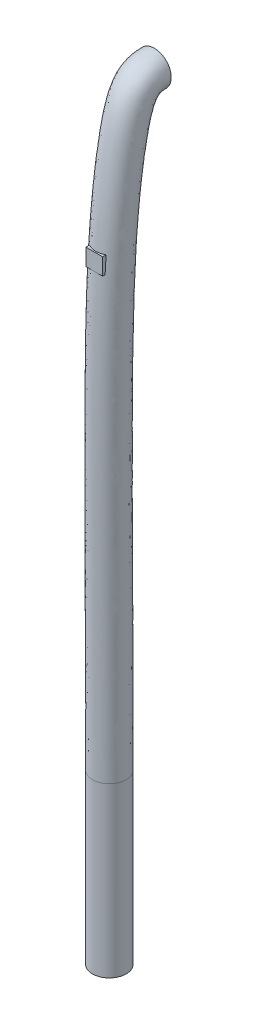
ISO-10303-21;
HEADER;
FILE_DESCRIPTION(('STEP AP214'),'2;1');
FILE_NAME('part.step','',(''),(''),'','','');
FILE_SCHEMA(('AUTOMOTIVE_DESIGN { 1 0 10303 214 1 1 1 1 }'));
ENDSEC;
DATA;
#1=APPLICATION_CONTEXT('core data for automotive mechanical design processes');
#2=APPLICATION_PROTOCOL_DEFINITION('international standard','automotive_design',2000,#1);
#3=PRODUCT_CONTEXT('',#1,'mechanical');
#4=PRODUCT('Part','Part','',(#3));
#5=PRODUCT_RELATED_PRODUCT_CATEGORY('part','',(#4));
#6=PRODUCT_DEFINITION_FORMATION('','',#4);
#7=PRODUCT_DEFINITION_CONTEXT('part definition',#1,'design');
#8=PRODUCT_DEFINITION('design','',#6,#7);
#9=PRODUCT_DEFINITION_SHAPE('','',#8);
#10=(LENGTH_UNIT() NAMED_UNIT(*) SI_UNIT(.MILLI.,.METRE.));
#11=(NAMED_UNIT(*) PLANE_ANGLE_UNIT() SI_UNIT($,.RADIAN.));
#12=(NAMED_UNIT(*) SI_UNIT($,.STERADIAN.) SOLID_ANGLE_UNIT());
#13=UNCERTAINTY_MEASURE_WITH_UNIT(LENGTH_MEASURE(1.E-05),#10,'distance_accuracy_value','');
#14=(GEOMETRIC_REPRESENTATION_CONTEXT(3) GLOBAL_UNCERTAINTY_ASSIGNED_CONTEXT((#13)) GLOBAL_UNIT_ASSIGNED_CONTEXT((#10,
#11,#12)) REPRESENTATION_CONTEXT('',''));
#15=CARTESIAN_POINT('',(0.,0.,0.));
#16=DIRECTION('',(0.,0.,1.));
#17=DIRECTION('',(1.,0.,0.));
#18=AXIS2_PLACEMENT_3D('',#15,#16,#17);
#19=CARTESIAN_POINT('',(-6.5266304410266,344.213384418299,-38.1));
#20=DIRECTION('',(0.,-1.,0.));
#21=DIRECTION('',(0.,0.,-1.));
#22=AXIS2_PLACEMENT_3D('',#19,#20,#21);
#23=PLANE('',#22);
#24=DIRECTION('',(-1.,0.,0.));
#25=VECTOR('',#24,1.);
#26=CARTESIAN_POINT('',(6.1733695589734,344.213384418299,-22.8599999999999));
#27=LINE('',#26,#25);
#28=CARTESIAN_POINT('',(6.1733695589734,344.213384418299,-22.8599999999999));
#29=VERTEX_POINT('',#28);
#30=CARTESIAN_POINT('',(-6.5266304410266,344.213384418299,-22.8599999999999));
#31=VERTEX_POINT('',#30);
#32=EDGE_CURVE('E70',#29,#31,#27,.T.);
#33=ORIENTED_EDGE('',*,*,#32,.F.);
#34=DIRECTION('',(0.,0.,1.));
#35=VECTOR('',#34,1.);
#36=CARTESIAN_POINT('',(6.1733695589734,344.213384418299,-38.1));
#37=LINE('',#36,#35);
#38=CARTESIAN_POINT('',(6.1733695589734,344.213384418299,-25.4717038859224));
#39=VERTEX_POINT('',#38);
#40=EDGE_CURVE('E104',#39,#29,#37,.T.);
#41=ORIENTED_EDGE('',*,*,#40,.F.);
#42=CARTESIAN_POINT('',(-6.5266304410266,344.213384418299,-25.6758827157528));
#43=CARTESIAN_POINT('',(-6.3223854863101,344.213384418299,-25.5534042328857));
#44=CARTESIAN_POINT('',(-6.1146880134214,344.213384418299,-25.4366850930022));
#45=CARTESIAN_POINT('',(-5.69307002536172,344.213384418299,-25.2151121585714));
#46=CARTESIAN_POINT('',(-5.47914980349759,344.213384418299,-25.1102578059174));
#47=CARTESIAN_POINT('',(-5.04575275534056,344.213384418299,-24.9127512424054));
#48=CARTESIAN_POINT('',(-4.82627602637849,344.213384418299,-24.8200988179878));
#49=CARTESIAN_POINT('',(-4.3828601443484,344.213384418299,-24.6474429146679));
#50=CARTESIAN_POINT('',(-4.15892976497471,344.213384418299,-24.5674168970073));
#51=CARTESIAN_POINT('',(-3.70692666551474,344.213384418299,-24.4200672907791));
#52=CARTESIAN_POINT('',(-3.47885398972474,344.213384418299,-24.3527435664652));
#53=CARTESIAN_POINT('',(-3.01930279574901,344.213384418299,-24.2310131918264));
#54=CARTESIAN_POINT('',(-2.78782428969163,344.213384418299,-24.1766064955151));
#55=CARTESIAN_POINT('',(-2.20559702171703,344.213384418299,-24.0569218357249));
#56=CARTESIAN_POINT('',(-1.85313124093958,344.213384418299,-23.999828716781));
#57=CARTESIAN_POINT('',(-1.14446223205283,344.213384418299,-23.915518910946));
#58=CARTESIAN_POINT('',(-0.788256904915703,344.213384418299,-23.8883200210004));
#59=CARTESIAN_POINT('',(-0.0747390800609061,344.213384418299,-23.8640386250858));
#60=CARTESIAN_POINT('',(0.282573648826439,344.213384418299,-23.8669628995182));
#61=CARTESIAN_POINT('',(0.995497831822092,344.213384418299,-23.9029224738871));
#62=CARTESIAN_POINT('',(1.35111014660986,344.213384418299,-23.9359404454096));
#63=CARTESIAN_POINT('',(1.96508363611767,344.213384418299,-24.0191777523242));
#64=CARTESIAN_POINT('',(2.22439160083093,344.213384418299,-24.0625766535412));
#65=CARTESIAN_POINT('',(2.73985384225984,344.213384418299,-24.165397723464));
#66=CARTESIAN_POINT('',(2.99600778200992,344.213384418299,-24.2248215889561));
#67=CARTESIAN_POINT('',(3.50414461686398,344.213384418299,-24.3594638680418));
#68=CARTESIAN_POINT('',(3.75612723406364,344.213384418299,-24.4346833294465));
#69=CARTESIAN_POINT('',(4.25561084879771,344.213384418299,-24.6008460522055));
#70=CARTESIAN_POINT('',(4.50309791315565,344.213384418299,-24.691831208589));
#71=CARTESIAN_POINT('',(4.99192191266633,344.213384418299,-24.8890315674753));
#72=CARTESIAN_POINT('',(5.23325896649831,344.213384418299,-24.9952464758209));
#73=CARTESIAN_POINT('',(5.70885417524314,344.213384418299,-25.2224792957568));
#74=CARTESIAN_POINT('',(5.94311247648754,344.213384418299,-25.3434969010851));
#75=CARTESIAN_POINT('',(6.1733695589734,344.213384418299,-25.4717038859224));
#76=B_SPLINE_CURVE_WITH_KNOTS('',3,(#42,#43,#44,#45,#46,#47,#48,#49,#50,#51,#52,#53,#54,#55,#56,
#57,#58,#59,#60,#61,#62,#63,#64,#65,#66,#67,#68,#69,#70,#71,#72,#73,#74,#75),.UNSPECIFIED.,.F.,
.F.,(4,2,2,2,2,2,2,2,2,2,2,2,2,2,2,2,4),(0.,0.714364192223999,1.42869476755605,2.14301283892543,
2.8560410281273,3.56906159693373,4.28207962724457,5.3519144769764,6.42238588758985,
7.49309825510762,8.56319447920758,9.35146377841871,10.1398165754744,10.9282216849563,
11.7187549281992,12.5092729046318,13.2997745283296),.UNSPECIFIED.);
#77=CARTESIAN_POINT('',(-6.5266304410266,344.213384418299,-25.6758827157528));
#78=VERTEX_POINT('',#77);
#79=EDGE_CURVE('E12',#78,#39,#76,.T.);
#80=ORIENTED_EDGE('',*,*,#79,.F.);
#81=DIRECTION('',(0.,0.,1.));
#82=VECTOR('',#81,1.);
#83=CARTESIAN_POINT('',(-6.5266304410266,344.213384418299,-38.1));
#84=LINE('',#83,#82);
#85=EDGE_CURVE('E106',#78,#31,#84,.T.);
#86=ORIENTED_EDGE('',*,*,#85,.T.);
#87=EDGE_LOOP('',(#33,#41,#80,#86));
#88=FACE_BOUND('',#87,.T.);
#89=ADVANCED_FACE('F51',(#88),#23,.F.);
#90=CARTESIAN_POINT('',(6.1733695589734,344.213384418299,-38.1));
#91=DIRECTION('',(-1.,0.,0.));
#92=DIRECTION('',(0.,-1.,0.));
#93=AXIS2_PLACEMENT_3D('',#90,#91,#92);
#94=PLANE('',#93);
#95=DIRECTION('',(0.,1.,0.));
#96=VECTOR('',#95,1.);
#97=CARTESIAN_POINT('',(6.1733695589734,331.513384418299,-22.8599999999999));
#98=LINE('',#97,#96);
#99=CARTESIAN_POINT('',(6.1733695589734,331.513384418299,-22.8599999999999));
#100=VERTEX_POINT('',#99);
#101=EDGE_CURVE('E92',#100,#29,#98,.T.);
#102=ORIENTED_EDGE('',*,*,#101,.F.);
#103=DIRECTION('',(0.,0.,1.));
#104=VECTOR('',#103,1.);
#105=CARTESIAN_POINT('',(6.1733695589734,331.513384418299,-38.1));
#106=LINE('',#105,#104);
#107=CARTESIAN_POINT('',(6.17336955897341,331.513384418299,-24.6979888195218));
#108=VERTEX_POINT('',#107);
#109=EDGE_CURVE('E111',#108,#100,#106,.T.);
#110=ORIENTED_EDGE('',*,*,#109,.F.);
#111=CARTESIAN_POINT('',(6.1733695589734,344.213384418299,-25.4717038859224));
#112=CARTESIAN_POINT('',(6.1733695589734,343.15704067904,-25.4000205624537));
#113=CARTESIAN_POINT('',(6.1733695589734,342.10056743177,-25.330253551604));
#114=CARTESIAN_POINT('',(6.1733695589734,339.987395542788,-25.1944111689609));
#115=CARTESIAN_POINT('',(6.1733695589734,338.93069690376,-25.128335755419));
#116=CARTESIAN_POINT('',(6.1733695589734,336.814016223512,-24.9995473112987));
#117=CARTESIAN_POINT('',(6.1733695589734,335.754033555326,-24.9368445979307));
#118=CARTESIAN_POINT('',(6.1733695589734,333.63385848236,-24.8148739473477));
#119=CARTESIAN_POINT('',(6.1733695589734,332.573666075336,-24.7556060491059));
#120=CARTESIAN_POINT('',(6.1733695589734,331.513384418299,-24.6979888195218));
#121=B_SPLINE_CURVE_WITH_KNOTS('',3,(#111,#112,#113,#114,#115,#116,#117,#118,#119,#120),
.UNSPECIFIED.,.F.,.F.,(4,2,2,2,4),(0.,3.17631695756363,6.35259798664727,9.53809922389118,
12.7236365985306),.UNSPECIFIED.);
#122=EDGE_CURVE('E63',#39,#108,#121,.T.);
#123=ORIENTED_EDGE('',*,*,#122,.F.);
#124=ORIENTED_EDGE('',*,*,#40,.T.);
#125=EDGE_LOOP('',(#102,#110,#123,#124));
#126=FACE_BOUND('',#125,.T.);
#127=ADVANCED_FACE('F109',(#126),#94,.F.);
#128=CARTESIAN_POINT('',(-6.5266304410266,331.513384418299,-38.1));
#129=DIRECTION('',(0.,-1.,0.));
#130=DIRECTION('',(0.,0.,-1.));
#131=AXIS2_PLACEMENT_3D('',#128,#129,#130);
#132=PLANE('',#131);
#133=ORIENTED_EDGE('',*,*,#109,.T.);
#134=DIRECTION('',(1.,0.,0.));
#135=VECTOR('',#134,1.);
#136=CARTESIAN_POINT('',(-6.5266304410266,331.513384418299,-22.8599999999999));
#137=LINE('',#136,#135);
#138=CARTESIAN_POINT('',(-6.5266304410266,331.513384418299,-22.8599999999999));
#139=VERTEX_POINT('',#138);
#140=EDGE_CURVE('E95',#139,#100,#137,.T.);
#141=ORIENTED_EDGE('',*,*,#140,.F.);
#142=DIRECTION('',(0.,0.,1.));
#143=VECTOR('',#142,1.);
#144=CARTESIAN_POINT('',(-6.5266304410266,331.513384418299,-38.1));
#145=LINE('',#144,#143);
#146=CARTESIAN_POINT('',(-6.5266304410266,331.513384418299,-24.902226215131));
#147=VERTEX_POINT('',#146);
#148=EDGE_CURVE('E116',#147,#139,#145,.T.);
#149=ORIENTED_EDGE('',*,*,#148,.F.);
#150=CARTESIAN_POINT('',(-6.5266304410266,331.513384418299,-24.902226215131));
#151=CARTESIAN_POINT('',(-6.32243107040896,331.513384418299,-24.7797399130251));
#152=CARTESIAN_POINT('',(-6.1147792106793,331.513384418299,-24.6630111907733));
#153=CARTESIAN_POINT('',(-5.69325189354982,331.513384418299,-24.4414159300077));
#154=CARTESIAN_POINT('',(-5.4793767236344,331.513384418299,-24.3365488446387));
#155=CARTESIAN_POINT('',(-5.04606894637347,331.513384418299,-24.1390142248839));
#156=CARTESIAN_POINT('',(-4.82663643501714,331.513384418299,-24.0463464799563));
#157=CARTESIAN_POINT('',(-4.3833081475311,331.513384418299,-23.8736579957013));
#158=CARTESIAN_POINT('',(-4.15942115382069,331.513384418299,-23.7936147039488));
#159=CARTESIAN_POINT('',(-3.70750361740144,331.513384418299,-23.646228896575));
#160=CARTESIAN_POINT('',(-3.47947312003681,331.513384418299,-23.5788862420567));
#161=CARTESIAN_POINT('',(-3.02000491564707,331.513384418299,-23.4571167469439));
#162=CARTESIAN_POINT('',(-2.78856722104739,331.513384418298,-23.4026898592603));
#163=CARTESIAN_POINT('',(-2.20644615490648,331.513384418298,-23.282954804471));
#164=CARTESIAN_POINT('',(-1.85404496511045,331.513384418299,-23.2258304113442));
#165=CARTESIAN_POINT('',(-1.14550203954025,331.513384418299,-23.1414559623627));
#166=CARTESIAN_POINT('',(-0.789358202790038,331.513384418299,-23.1142237029539));
#167=CARTESIAN_POINT('',(-0.0759600736174931,331.513384418299,-23.0898740700172));
#168=CARTESIAN_POINT('',(0.281294451470557,331.513384418299,-23.0927635004537));
#169=CARTESIAN_POINT('',(0.994105054118129,331.513384418299,-23.1286521785193));
#170=CARTESIAN_POINT('',(1.34966199067249,331.513384418299,-23.1616341002415));
#171=CARTESIAN_POINT('',(1.96367456220772,331.513384418299,-23.2448256112122));
#172=CARTESIAN_POINT('',(2.22307520352059,331.513384418299,-23.288223336418));
#173=CARTESIAN_POINT('',(2.73872066141702,331.513384418299,-23.3910573851551));
#174=CARTESIAN_POINT('',(2.99496513853038,331.513384418299,-23.4504954184648));
#175=CARTESIAN_POINT('',(3.50327945071313,331.513384418299,-23.5851807158515));
#176=CARTESIAN_POINT('',(3.75534900499744,331.513384418299,-23.6604290386315));
#177=CARTESIAN_POINT('',(4.25500375867613,331.513384418299,-23.8266640591049));
#178=CARTESIAN_POINT('',(4.50257496753664,331.513384418299,-23.91769282033));
#179=CARTESIAN_POINT('',(4.99156076262391,331.513384418299,-24.1149933920937));
#180=CARTESIAN_POINT('',(5.23297547059981,331.513384418299,-24.2212649009207));
#181=CARTESIAN_POINT('',(5.70871831519847,331.513384418299,-24.4486225521884));
#182=CARTESIAN_POINT('',(5.94304660870776,331.513384418299,-24.5697083663546));
#183=CARTESIAN_POINT('',(6.1733695589734,331.513384418299,-24.6979888195218));
#184=B_SPLINE_CURVE_WITH_KNOTS('',3,(#150,#151,#152,#153,#154,#155,#156,#157,#158,#159,#160,
#161,#162,#163,#164,#165,#166,#167,#168,#169,#170,#171,#172,#173,#174,#175,#176,#177,#178,#179,
#180,#181,#182,#183),.UNSPECIFIED.,.F.,.F.,(4,2,2,2,2,2,2,2,2,2,2,2,2,2,2,2,4),(0.,
0.7142590562994,1.42848516978158,2.14269895519629,2.85562204786328,3.56853734338862,
4.28145003968437,5.35110858033596,6.4214036032489,7.49194039238021,8.56186120312514,
9.35040333258764,10.139029548041,10.9277085890447,11.7185231582784,12.5093220764523,
13.3001034742487),.UNSPECIFIED.);
#185=EDGE_CURVE('E132',#147,#108,#184,.T.);
#186=ORIENTED_EDGE('',*,*,#185,.T.);
#187=EDGE_LOOP('',(#133,#141,#149,#186));
#188=FACE_BOUND('',#187,.T.);
#189=ADVANCED_FACE('F146',(#188),#132,.T.);
#190=CARTESIAN_POINT('',(-6.5266304410266,344.213384418299,-38.1));
#191=DIRECTION('',(-1.,0.,0.));
#192=DIRECTION('',(0.,0.,1.));
#193=AXIS2_PLACEMENT_3D('',#190,#191,#192);
#194=PLANE('',#193);
#195=ORIENTED_EDGE('',*,*,#148,.T.);
#196=DIRECTION('',(0.,-1.,0.));
#197=VECTOR('',#196,1.);
#198=CARTESIAN_POINT('',(-6.5266304410266,344.213384418299,-22.8599999999999));
#199=LINE('',#198,#197);
#200=EDGE_CURVE('E107',#31,#139,#199,.T.);
#201=ORIENTED_EDGE('',*,*,#200,.F.);
#202=ORIENTED_EDGE('',*,*,#85,.F.);
#203=CARTESIAN_POINT('',(-6.5266304410266,344.213384418299,-25.6758827157528));
#204=CARTESIAN_POINT('',(-6.5266304410266,343.157161048179,-25.6042104663231));
#205=CARTESIAN_POINT('',(-6.5266304410266,342.100808147035,-25.5344549808972));
#206=CARTESIAN_POINT('',(-6.5266304410266,339.987876942743,-25.3986359969166));
#207=CARTESIAN_POINT('',(-6.52663044102659,338.931298642281,-25.3325724566001));
#208=CARTESIAN_POINT('',(-6.52663044102659,336.814618013182,-25.2037929231315));
#209=CARTESIAN_POINT('',(-6.52663044102659,335.754515008331,-25.1410880584288));
#210=CARTESIAN_POINT('',(-6.5266304410266,333.634099224984,-25.0191139170957));
#211=CARTESIAN_POINT('',(-6.5266304410266,332.573786444245,-24.9598446794654));
#212=CARTESIAN_POINT('',(-6.5266304410266,331.513384418299,-24.902226215131));
#213=B_SPLINE_CURVE_WITH_KNOTS('',3,(#203,#204,#205,#206,#207,#208,#209,#210,#211,#212),
.UNSPECIFIED.,.F.,.F.,(4,2,2,2,4),(0.,3.17595442500757,6.3518729176656,9.53773491365943,
12.7236330673809),.UNSPECIFIED.);
#214=EDGE_CURVE('E125',#78,#147,#213,.T.);
#215=ORIENTED_EDGE('',*,*,#214,.T.);
#216=EDGE_LOOP('',(#195,#201,#202,#215));
#217=FACE_BOUND('',#216,.T.);
#218=ADVANCED_FACE('F142',(#217),#194,.T.);
#219=CARTESIAN_POINT('',(0.,0.,-21.3818772335764));
#220=CARTESIAN_POINT('',(0.,51.458610160128,-21.3810868579543));
#221=CARTESIAN_POINT('',(0.,142.429630870905,-20.9114867054874));
#222=CARTESIAN_POINT('',(0.,248.887758562846,-20.5579334496353));
#223=CARTESIAN_POINT('',(0.,330.985853185016,-22.2208215617449));
#224=CARTESIAN_POINT('',(0.,380.665207995244,-26.7079206140638));
#225=CARTESIAN_POINT('',(0.,411.197552694387,-31.7616881445268));
#226=CARTESIAN_POINT('',(0.,426.180486995187,-35.1878257889518));
#227=CARTESIAN_POINT('',(0.,434.980023025765,-38.5863292103482));
#228=CARTESIAN_POINT('',(0.,440.538219161758,-41.3501310593408));
#229=CARTESIAN_POINT('',(0.,444.272455319786,-43.6580751227552));
#230=CARTESIAN_POINT('',(0.,448.490830004977,-47.9673863925611));
#231=CARTESIAN_POINT('',(0.,450.892171866904,-51.363232723905));
#232=CARTESIAN_POINT('',(0.,452.767809331428,-55.2141294859461));
#233=CARTESIAN_POINT('',(0.,454.031999763017,-59.3347849307667));
#234=CARTESIAN_POINT('',(0.,454.736631168798,-63.6373449321753));
#235=CARTESIAN_POINT('',(0.,454.86180212385,-66.5599996360718));
#236=CARTESIAN_POINT('',(0.,454.872200750059,-68.0983939840303));
#237=CARTESIAN_POINT('',(25.4,0.,-21.3818772335764));
#238=CARTESIAN_POINT('',(25.4,51.458610160128,-21.3810868579543));
#239=CARTESIAN_POINT('',(25.4,142.429630870905,-20.9114867054874));
#240=CARTESIAN_POINT('',(25.4,248.887758562846,-20.5579334496353));
#241=CARTESIAN_POINT('',(25.4,330.985853185017,-22.2208215617449));
#242=CARTESIAN_POINT('',(25.4,380.665207995244,-26.7079206140638));
#243=CARTESIAN_POINT('',(25.4,411.197552694387,-31.7616881445268));
#244=CARTESIAN_POINT('',(25.4,426.180486995187,-35.1878257889518));
#245=CARTESIAN_POINT('',(25.4,434.980023025765,-38.5863292103482));
#246=CARTESIAN_POINT('',(25.4,440.538219161758,-41.3501310593408));
#247=CARTESIAN_POINT('',(25.4,444.272455319786,-43.6580751227551));
#248=CARTESIAN_POINT('',(25.4,448.490830004977,-47.9673863925611));
#249=CARTESIAN_POINT('',(25.4,450.892171866903,-51.363232723905));
#250=CARTESIAN_POINT('',(25.4,452.767809331428,-55.2141294859461));
#251=CARTESIAN_POINT('',(25.4,454.031999763017,-59.3347849307667));
#252=CARTESIAN_POINT('',(25.4,454.736631168798,-63.6373449321753));
#253=CARTESIAN_POINT('',(25.4,454.86180212385,-66.5599996360718));
#254=CARTESIAN_POINT('',(25.4,454.872200750059,-68.0983939840303));
#255=CARTESIAN_POINT('',(25.4,0.,-46.7818772335764));
#256=CARTESIAN_POINT('',(25.4,51.522081410983,-46.7826676091984));
#257=CARTESIAN_POINT('',(25.4,142.62004462347,-46.3162289592195));
#258=CARTESIAN_POINT('',(25.4,248.796375650522,-45.9374904620759));
#259=CARTESIAN_POINT('',(25.4,330.071903072416,-47.6939599056535));
#260=CARTESIAN_POINT('',(25.4,377.452537891122,-51.7656780830233));
#261=CARTESIAN_POINT('',(25.4,406.674074861576,-56.9362008463299));
#262=CARTESIAN_POINT('',(25.4,419.418181023263,-59.7552699808695));
#263=CARTESIAN_POINT('',(25.4,425.143336652316,-62.0397264776097));
#264=CARTESIAN_POINT('',(25.4,427.666979510293,-63.3488214473732));
#265=CARTESIAN_POINT('',(25.4,428.718355325007,-64.0711632004393));
#266=CARTESIAN_POINT('',(25.4,428.887953950394,-64.2887932389198));
#267=CARTESIAN_POINT('',(25.4,428.925683834491,-64.3373606840663));
#268=CARTESIAN_POINT('',(25.4,429.014483190232,-64.4978637761064));
#269=CARTESIAN_POINT('',(25.4,429.20219283063,-65.0450487315747));
#270=CARTESIAN_POINT('',(25.4,429.39902292605,-66.156224145292));
#271=CARTESIAN_POINT('',(25.4,429.482599376268,-67.3996260404452));
#272=CARTESIAN_POINT('',(25.4,429.472200750059,-68.0983939840303));
#273=CARTESIAN_POINT('',(0.,0.,-46.7818772335764));
#274=CARTESIAN_POINT('',(0.,51.522081410983,-46.7826676091984));
#275=CARTESIAN_POINT('',(0.,142.62004462347,-46.3162289592196));
#276=CARTESIAN_POINT('',(0.,248.796375650522,-45.9374904620759));
#277=CARTESIAN_POINT('',(0.,330.071903072416,-47.6939599056536));
#278=CARTESIAN_POINT('',(0.,377.452537891122,-51.7656780830233));
#279=CARTESIAN_POINT('',(0.,406.674074861576,-56.9362008463299));
#280=CARTESIAN_POINT('',(0.,419.418181023263,-59.7552699808695));
#281=CARTESIAN_POINT('',(0.,425.143336652316,-62.0397264776097));
#282=CARTESIAN_POINT('',(0.,427.666979510293,-63.3488214473732));
#283=CARTESIAN_POINT('',(0.,428.718355325007,-64.0711632004393));
#284=CARTESIAN_POINT('',(0.,428.887953950394,-64.2887932389198));
#285=CARTESIAN_POINT('',(0.,428.925683834491,-64.3373606840663));
#286=CARTESIAN_POINT('',(0.,429.014483190232,-64.4978637761064));
#287=CARTESIAN_POINT('',(0.,429.20219283063,-65.0450487315746));
#288=CARTESIAN_POINT('',(0.,429.39902292605,-66.156224145292));
#289=CARTESIAN_POINT('',(0.,429.482599376268,-67.3996260404452));
#290=CARTESIAN_POINT('',(0.,429.472200750059,-68.0983939840303));
#291=CARTESIAN_POINT('',(-25.4,0.,-46.7818772335764));
#292=CARTESIAN_POINT('',(-25.4,51.522081410983,-46.7826676091984));
#293=CARTESIAN_POINT('',(-25.4,142.62004462347,-46.3162289592195));
#294=CARTESIAN_POINT('',(-25.4,248.796375650522,-45.9374904620759));
#295=CARTESIAN_POINT('',(-25.4,330.071903072416,-47.6939599056535));
#296=CARTESIAN_POINT('',(-25.4,377.452537891122,-51.7656780830233));
#297=CARTESIAN_POINT('',(-25.4,406.674074861576,-56.9362008463299));
#298=CARTESIAN_POINT('',(-25.4,419.418181023263,-59.7552699808695));
#299=CARTESIAN_POINT('',(-25.4,425.143336652316,-62.0397264776097));
#300=CARTESIAN_POINT('',(-25.4,427.666979510293,-63.3488214473732));
#301=CARTESIAN_POINT('',(-25.4,428.718355325007,-64.0711632004393));
#302=CARTESIAN_POINT('',(-25.4,428.887953950394,-64.2887932389198));
#303=CARTESIAN_POINT('',(-25.4,428.925683834491,-64.3373606840663));
#304=CARTESIAN_POINT('',(-25.4,429.014483190232,-64.4978637761064));
#305=CARTESIAN_POINT('',(-25.4,429.20219283063,-65.0450487315747));
#306=CARTESIAN_POINT('',(-25.4,429.39902292605,-66.156224145292));
#307=CARTESIAN_POINT('',(-25.4,429.482599376268,-67.3996260404452));
#308=CARTESIAN_POINT('',(-25.4,429.472200750059,-68.0983939840303));
#309=CARTESIAN_POINT('',(-25.4,0.,-21.3818772335764));
#310=CARTESIAN_POINT('',(-25.4,51.458610160128,-21.3810868579543));
#311=CARTESIAN_POINT('',(-25.4,142.429630870905,-20.9114867054874));
#312=CARTESIAN_POINT('',(-25.4,248.887758562846,-20.5579334496353));
#313=CARTESIAN_POINT('',(-25.4,330.985853185017,-22.2208215617449));
#314=CARTESIAN_POINT('',(-25.4,380.665207995244,-26.7079206140638));
#315=CARTESIAN_POINT('',(-25.4,411.197552694387,-31.7616881445268));
#316=CARTESIAN_POINT('',(-25.4,426.180486995187,-35.1878257889518));
#317=CARTESIAN_POINT('',(-25.4,434.980023025765,-38.5863292103482));
#318=CARTESIAN_POINT('',(-25.4,440.538219161758,-41.3501310593408));
#319=CARTESIAN_POINT('',(-25.4,444.272455319786,-43.6580751227551));
#320=CARTESIAN_POINT('',(-25.4,448.490830004977,-47.9673863925611));
#321=CARTESIAN_POINT('',(-25.4,450.892171866903,-51.363232723905));
#322=CARTESIAN_POINT('',(-25.4,452.767809331428,-55.2141294859461));
#323=CARTESIAN_POINT('',(-25.4,454.031999763017,-59.3347849307667));
#324=CARTESIAN_POINT('',(-25.4,454.736631168798,-63.6373449321753));
#325=CARTESIAN_POINT('',(-25.4,454.86180212385,-66.5599996360718));
#326=CARTESIAN_POINT('',(-25.4,454.872200750059,-68.0983939840303));
#327=CARTESIAN_POINT('',(0.,0.,-21.3818772335764));
#328=CARTESIAN_POINT('',(0.,51.458610160128,-21.3810868579543));
#329=CARTESIAN_POINT('',(0.,142.429630870905,-20.9114867054874));
#330=CARTESIAN_POINT('',(0.,248.887758562846,-20.5579334496353));
#331=CARTESIAN_POINT('',(0.,330.985853185016,-22.2208215617449));
#332=CARTESIAN_POINT('',(0.,380.665207995244,-26.7079206140638));
#333=CARTESIAN_POINT('',(0.,411.197552694387,-31.7616881445268));
#334=CARTESIAN_POINT('',(0.,426.180486995187,-35.1878257889518));
#335=CARTESIAN_POINT('',(0.,434.980023025765,-38.5863292103482));
#336=CARTESIAN_POINT('',(0.,440.538219161758,-41.3501310593408));
#337=CARTESIAN_POINT('',(0.,444.272455319786,-43.6580751227552));
#338=CARTESIAN_POINT('',(0.,448.490830004977,-47.9673863925611));
#339=CARTESIAN_POINT('',(0.,450.892171866904,-51.363232723905));
#340=CARTESIAN_POINT('',(0.,452.767809331428,-55.2141294859461));
#341=CARTESIAN_POINT('',(0.,454.031999763017,-59.3347849307667));
#342=CARTESIAN_POINT('',(0.,454.736631168798,-63.6373449321753));
#343=CARTESIAN_POINT('',(0.,454.86180212385,-66.5599996360718));
#344=CARTESIAN_POINT('',(0.,454.872200750059,-68.0983939840303));
#345=(BOUNDED_SURFACE() B_SPLINE_SURFACE(3,3,((#219,#220,#221,#222,#223,#224,#225,#226,#227,
#228,#229,#230,#231,#232,#233,#234,#235,#236),(#237,#238,#239,#240,#241,#242,#243,#244,#245,
#246,#247,#248,#249,#250,#251,#252,#253,#254),(#255,#256,#257,#258,#259,#260,#261,#262,#263,
#264,#265,#266,#267,#268,#269,#270,#271,#272),(#273,#274,#275,#276,#277,#278,#279,#280,#281,
#282,#283,#284,#285,#286,#287,#288,#289,#290),(#291,#292,#293,#294,#295,#296,#297,#298,#299,
#300,#301,#302,#303,#304,#305,#306,#307,#308),(#309,#310,#311,#312,#313,#314,#315,#316,#317,
#318,#319,#320,#321,#322,#323,#324,#325,#326),(#327,#328,#329,#330,#331,#332,#333,#334,#335,
#336,#337,#338,#339,#340,#341,#342,#343,#344)),.UNSPECIFIED.,.T.,.F.,
.F.) B_SPLINE_SURFACE_WITH_KNOTS((4,3,4),(4,1,1,1,1,1,1,1,1,1,1,1,1,1,1,4),(0.,0.5,1.),(0.,
0.1875,0.375,0.5625,0.75,0.810651319725855,0.875,0.90625,0.910651319725855,0.9375,
0.947916666666667,0.958333333333333,0.96875,0.979166666666707,0.989583333333333,1.),
.UNSPECIFIED.) GEOMETRIC_REPRESENTATION_ITEM() RATIONAL_B_SPLINE_SURFACE(((1.,1.,1.,1.,1.,1.,1.,
1.,1.,1.,1.,1.,1.,1.,1.,1.,1.,1.),(0.333333333333333,0.333333333333333,0.333333333333333,
0.333333333333333,0.333333333333333,0.333333333333333,0.333333333333333,0.333333333333333,
0.333333333333333,0.333333333333333,0.333333333333333,0.333333333333333,0.333333333333333,
0.333333333333333,0.333333333333333,0.333333333333333,0.333333333333333,0.333333333333333),
(0.333333333333333,0.333333333333333,0.333333333333333,0.333333333333333,0.333333333333333,
0.333333333333333,0.333333333333333,0.333333333333333,0.333333333333333,0.333333333333333,
0.333333333333333,0.333333333333333,0.333333333333333,0.333333333333333,0.333333333333333,
0.333333333333333,0.333333333333333,0.333333333333333),(1.,1.,1.,1.,1.,1.,1.,1.,1.,1.,1.,1.,1.,
1.,1.,1.,1.,1.),(0.333333333333333,0.333333333333333,0.333333333333333,0.333333333333333,
0.333333333333333,0.333333333333333,0.333333333333333,0.333333333333333,0.333333333333333,
0.333333333333333,0.333333333333333,0.333333333333333,0.333333333333333,0.333333333333333,
0.333333333333333,0.333333333333333,0.333333333333333,0.333333333333333),(0.333333333333333,
0.333333333333333,0.333333333333333,0.333333333333333,0.333333333333333,0.333333333333333,
0.333333333333333,0.333333333333333,0.333333333333333,0.333333333333333,0.333333333333333,
0.333333333333333,0.333333333333333,0.333333333333333,0.333333333333333,0.333333333333333,
0.333333333333333,0.333333333333333),(1.,1.,1.,1.,1.,1.,1.,1.,1.,1.,1.,1.,1.,1.,1.,1.,1.,1.))) REPRESENTATION_ITEM('') SURFACE());
#346=CARTESIAN_POINT('',(0.,442.172200750059,-68.0983939840303));
#347=DIRECTION('',(0.,0.,1.));
#348=DIRECTION('',(1.,0.,0.));
#349=AXIS2_PLACEMENT_3D('',#346,#347,#348);
#350=CIRCLE('',#349,12.7);
#351=CARTESIAN_POINT('',(12.7,442.172200750059,-68.0983939840303));
#352=VERTEX_POINT('',#351);
#353=EDGE_CURVE('E121',#352,#352,#350,.T.);
#354=CARTESIAN_POINT('',(0.,0.,-34.0818772335764));
#355=DIRECTION('',(0.,-1.,0.));
#356=DIRECTION('',(0.,0.,-1.));
#357=AXIS2_PLACEMENT_3D('',#354,#355,#356);
#358=CIRCLE('',#357,12.7);
#359=CARTESIAN_POINT('',(0.,0.,-46.7818772335764));
#360=VERTEX_POINT('',#359);
#361=EDGE_CURVE('E110',#360,#360,#358,.T.);
#362=ORIENTED_EDGE('',*,*,#353,.T.);
#363=EDGE_LOOP('',(#362));
#364=FACE_BOUND('',#363,.T.);
#365=ORIENTED_EDGE('',*,*,#361,.F.);
#366=EDGE_LOOP('',(#365));
#367=FACE_BOUND('',#366,.T.);
#368=ORIENTED_EDGE('',*,*,#214,.F.);
#369=ORIENTED_EDGE('',*,*,#79,.T.);
#370=ORIENTED_EDGE('',*,*,#122,.T.);
#371=ORIENTED_EDGE('',*,*,#185,.F.);
#372=EDGE_LOOP('',(#368,#369,#370,#371));
#373=FACE_BOUND('',#372,.T.);
#374=ADVANCED_FACE('F137',(#364,#367,#373),#345,.T.);
#375=CARTESIAN_POINT('',(0.,429.472200750059,-68.0983939840303));
#376=DIRECTION('',(0.,0.,1.));
#377=DIRECTION('',(1.,0.,0.));
#378=AXIS2_PLACEMENT_3D('',#375,#376,#377);
#379=PLANE('',#378);
#380=ORIENTED_EDGE('',*,*,#353,.F.);
#381=EDGE_LOOP('',(#380));
#382=FACE_BOUND('',#381,.T.);
#383=ADVANCED_FACE('F53',(#382),#379,.F.);
#384=CARTESIAN_POINT('',(0.,-127.,-34.0818772335764));
#385=DIRECTION('',(0.,1.,0.));
#386=DIRECTION('',(0.,0.,1.));
#387=AXIS2_PLACEMENT_3D('',#384,#385,#386);
#388=CYLINDRICAL_SURFACE('',#387,12.7);
#389=CARTESIAN_POINT('',(0.,-127.,-34.0818772335764));
#390=DIRECTION('',(0.,-1.,0.));
#391=DIRECTION('',(0.,0.,-1.));
#392=AXIS2_PLACEMENT_3D('',#389,#390,#391);
#393=CIRCLE('',#392,12.7);
#394=CARTESIAN_POINT('',(0.,-127.,-46.7818772335764));
#395=VERTEX_POINT('',#394);
#396=EDGE_CURVE('E114',#395,#395,#393,.T.);
#397=ORIENTED_EDGE('',*,*,#396,.F.);
#398=EDGE_LOOP('',(#397));
#399=FACE_BOUND('',#398,.T.);
#400=ORIENTED_EDGE('',*,*,#361,.T.);
#401=EDGE_LOOP('',(#400));
#402=FACE_BOUND('',#401,.T.);
#403=ADVANCED_FACE('F170',(#399,#402),#388,.T.);
#404=CARTESIAN_POINT('',(0.,-127.,-34.0818772335764));
#405=DIRECTION('',(0.,-1.,0.));
#406=DIRECTION('',(0.,0.,-1.));
#407=AXIS2_PLACEMENT_3D('',#404,#405,#406);
#408=PLANE('',#407);
#409=ORIENTED_EDGE('',*,*,#396,.T.);
#410=EDGE_LOOP('',(#409));
#411=FACE_BOUND('',#410,.T.);
#412=ADVANCED_FACE('F197',(#411),#408,.T.);
#413=CARTESIAN_POINT('',(0.,0.,-22.8599999999999));
#414=DIRECTION('',(0.,0.,1.));
#415=DIRECTION('',(1.,0.,0.));
#416=AXIS2_PLACEMENT_3D('',#413,#414,#415);
#417=PLANE('',#416);
#418=ORIENTED_EDGE('',*,*,#101,.T.);
#419=ORIENTED_EDGE('',*,*,#32,.T.);
#420=ORIENTED_EDGE('',*,*,#200,.T.);
#421=ORIENTED_EDGE('',*,*,#140,.T.);
#422=EDGE_LOOP('',(#418,#419,#420,#421));
#423=FACE_BOUND('',#422,.T.);
#424=ADVANCED_FACE('F93',(#423),#417,.T.);
#425=CLOSED_SHELL('',(#89,#127,#189,#218,#374,#383,#403,#412,#424));
#426=MANIFOLD_SOLID_BREP('B2',#425);
#427=ADVANCED_BREP_SHAPE_REPRESENTATION('',(#18,#426),#14);
#428=SHAPE_DEFINITION_REPRESENTATION(#9,#427);
ENDSEC;
END-ISO-10303-21;
